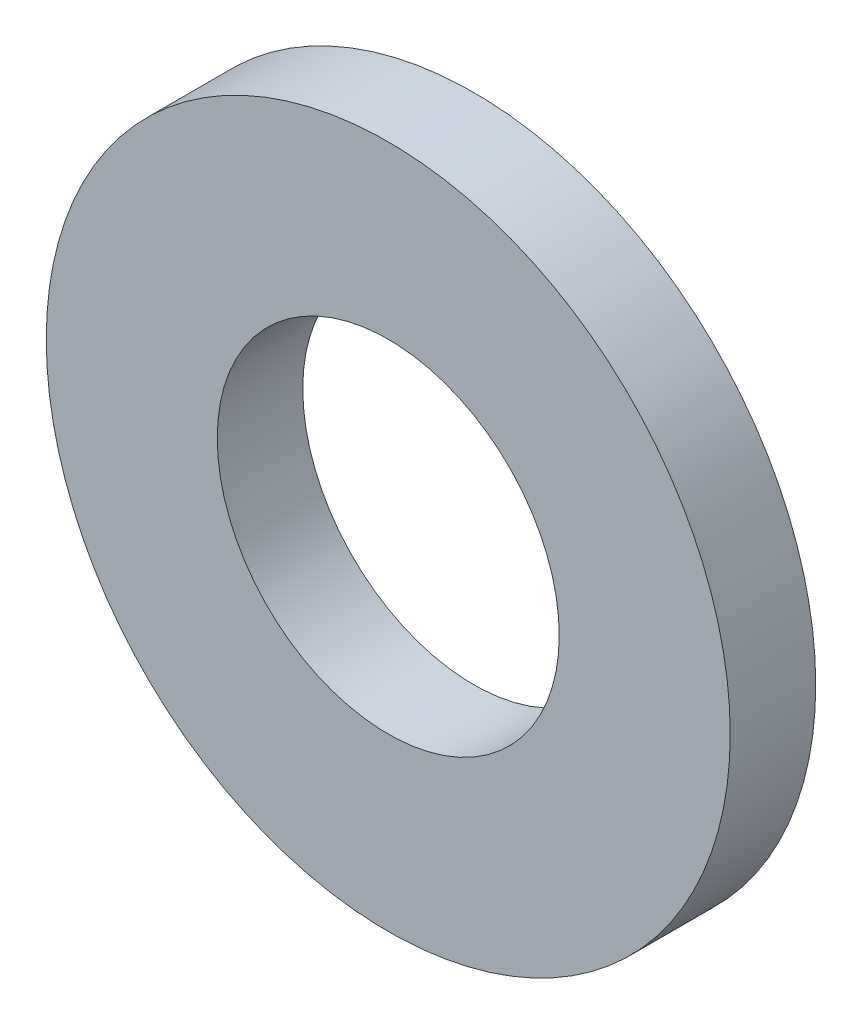
ISO-10303-21;
HEADER;
FILE_DESCRIPTION(('STEP AP214'),'2;1');
FILE_NAME('part.step','',(''),(''),'','','');
FILE_SCHEMA(('AUTOMOTIVE_DESIGN { 1 0 10303 214 1 1 1 1 }'));
ENDSEC;
DATA;
#1=APPLICATION_CONTEXT('core data for automotive mechanical design processes');
#2=APPLICATION_PROTOCOL_DEFINITION('international standard','automotive_design',2000,#1);
#3=PRODUCT_CONTEXT('',#1,'mechanical');
#4=PRODUCT('Part','Part','',(#3));
#5=PRODUCT_RELATED_PRODUCT_CATEGORY('part','',(#4));
#6=PRODUCT_DEFINITION_FORMATION('','',#4);
#7=PRODUCT_DEFINITION_CONTEXT('part definition',#1,'design');
#8=PRODUCT_DEFINITION('design','',#6,#7);
#9=PRODUCT_DEFINITION_SHAPE('','',#8);
#10=(LENGTH_UNIT() NAMED_UNIT(*) SI_UNIT(.MILLI.,.METRE.));
#11=(NAMED_UNIT(*) PLANE_ANGLE_UNIT() SI_UNIT($,.RADIAN.));
#12=(NAMED_UNIT(*) SI_UNIT($,.STERADIAN.) SOLID_ANGLE_UNIT());
#13=UNCERTAINTY_MEASURE_WITH_UNIT(LENGTH_MEASURE(1.E-05),#10,'distance_accuracy_value','');
#14=(GEOMETRIC_REPRESENTATION_CONTEXT(3) GLOBAL_UNCERTAINTY_ASSIGNED_CONTEXT((#13)) GLOBAL_UNIT_ASSIGNED_CONTEXT((#10,
#11,#12)) REPRESENTATION_CONTEXT('',''));
#15=CARTESIAN_POINT('',(0.,0.,0.));
#16=DIRECTION('',(0.,0.,1.));
#17=DIRECTION('',(1.,0.,0.));
#18=AXIS2_PLACEMENT_3D('',#15,#16,#17);
#19=CARTESIAN_POINT('',(0.,0.,1.5));
#20=DIRECTION('',(0.,0.,1.));
#21=DIRECTION('',(1.,0.,0.));
#22=AXIS2_PLACEMENT_3D('',#19,#20,#21);
#23=PLANE('',#22);
#24=CARTESIAN_POINT('',(0.,0.,1.5));
#25=DIRECTION('',(0.,0.,1.));
#26=DIRECTION('',(1.,0.,0.));
#27=AXIS2_PLACEMENT_3D('',#24,#25,#26);
#28=CIRCLE('',#27,6.);
#29=CARTESIAN_POINT('',(6.,0.,1.5));
#30=VERTEX_POINT('',#29);
#31=EDGE_CURVE('E10',#30,#30,#28,.T.);
#32=ORIENTED_EDGE('',*,*,#31,.T.);
#33=EDGE_LOOP('',(#32));
#34=FACE_BOUND('',#33,.T.);
#35=CARTESIAN_POINT('',(0.,0.,1.5));
#36=DIRECTION('',(0.,0.,1.));
#37=DIRECTION('',(1.,0.,0.));
#38=AXIS2_PLACEMENT_3D('',#35,#36,#37);
#39=CIRCLE('',#38,3.);
#40=CARTESIAN_POINT('',(3.,0.,1.5));
#41=VERTEX_POINT('',#40);
#42=EDGE_CURVE('E42',#41,#41,#39,.T.);
#43=ORIENTED_EDGE('',*,*,#42,.F.);
#44=EDGE_LOOP('',(#43));
#45=FACE_BOUND('',#44,.T.);
#46=ADVANCED_FACE('F31',(#34,#45),#23,.T.);
#47=CARTESIAN_POINT('',(0.,0.,0.));
#48=DIRECTION('',(0.,0.,1.));
#49=DIRECTION('',(1.,0.,0.));
#50=AXIS2_PLACEMENT_3D('',#47,#48,#49);
#51=PLANE('',#50);
#52=CARTESIAN_POINT('',(0.,0.,0.));
#53=DIRECTION('',(0.,0.,1.));
#54=DIRECTION('',(1.,0.,0.));
#55=AXIS2_PLACEMENT_3D('',#52,#53,#54);
#56=CIRCLE('',#55,6.);
#57=CARTESIAN_POINT('',(6.,0.,0.));
#58=VERTEX_POINT('',#57);
#59=EDGE_CURVE('E35',#58,#58,#56,.T.);
#60=ORIENTED_EDGE('',*,*,#59,.F.);
#61=EDGE_LOOP('',(#60));
#62=FACE_BOUND('',#61,.T.);
#63=CARTESIAN_POINT('',(0.,0.,0.));
#64=DIRECTION('',(0.,0.,1.));
#65=DIRECTION('',(1.,0.,0.));
#66=AXIS2_PLACEMENT_3D('',#63,#64,#65);
#67=CIRCLE('',#66,3.);
#68=CARTESIAN_POINT('',(3.,0.,0.));
#69=VERTEX_POINT('',#68);
#70=EDGE_CURVE('E44',#69,#69,#67,.T.);
#71=ORIENTED_EDGE('',*,*,#70,.T.);
#72=EDGE_LOOP('',(#71));
#73=FACE_BOUND('',#72,.T.);
#74=ADVANCED_FACE('F54',(#62,#73),#51,.F.);
#75=CARTESIAN_POINT('',(0.,0.,1.5));
#76=DIRECTION('',(0.,0.,-1.));
#77=DIRECTION('',(-1.,0.,0.));
#78=AXIS2_PLACEMENT_3D('',#75,#76,#77);
#79=CYLINDRICAL_SURFACE('',#78,6.);
#80=ORIENTED_EDGE('',*,*,#31,.F.);
#81=EDGE_LOOP('',(#80));
#82=FACE_BOUND('',#81,.T.);
#83=ORIENTED_EDGE('',*,*,#59,.T.);
#84=EDGE_LOOP('',(#83));
#85=FACE_BOUND('',#84,.T.);
#86=ADVANCED_FACE('F33',(#82,#85),#79,.T.);
#87=CARTESIAN_POINT('',(0.,0.,1.5));
#88=DIRECTION('',(0.,0.,-1.));
#89=DIRECTION('',(-1.,0.,0.));
#90=AXIS2_PLACEMENT_3D('',#87,#88,#89);
#91=CYLINDRICAL_SURFACE('',#90,3.);
#92=ORIENTED_EDGE('',*,*,#42,.T.);
#93=EDGE_LOOP('',(#92));
#94=FACE_BOUND('',#93,.T.);
#95=ORIENTED_EDGE('',*,*,#70,.F.);
#96=EDGE_LOOP('',(#95));
#97=FACE_BOUND('',#96,.T.);
#98=ADVANCED_FACE('F50',(#94,#97),#91,.F.);
#99=CLOSED_SHELL('',(#46,#74,#86,#98));
#100=MANIFOLD_SOLID_BREP('B2',#99);
#101=ADVANCED_BREP_SHAPE_REPRESENTATION('',(#18,#100),#14);
#102=SHAPE_DEFINITION_REPRESENTATION(#9,#101);
ENDSEC;
END-ISO-10303-21;
